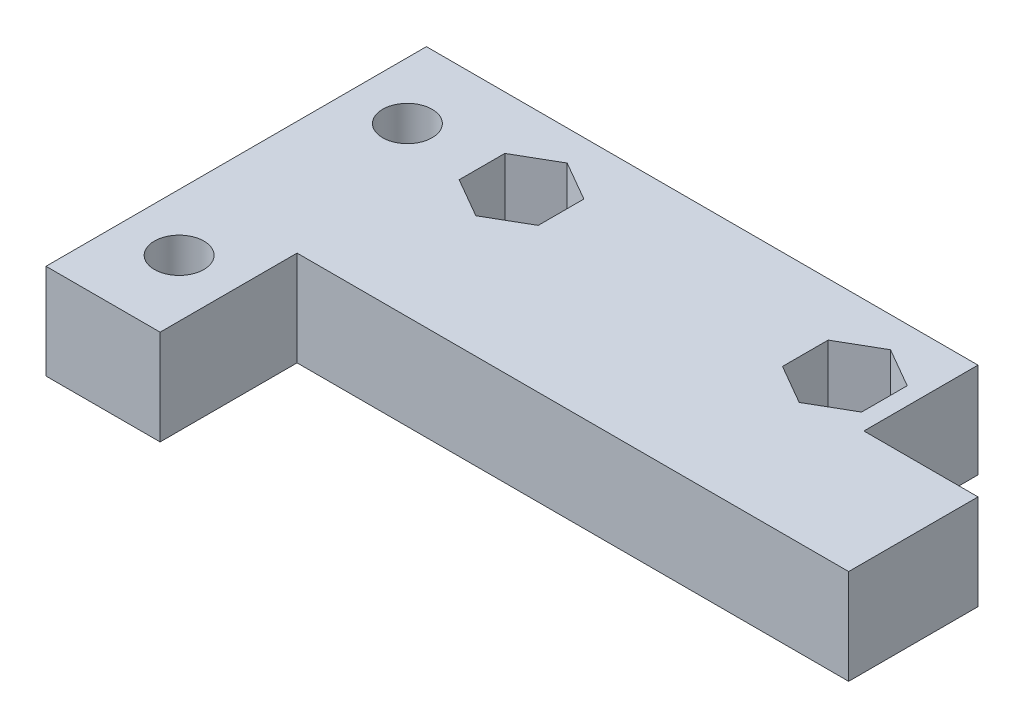
ISO-10303-21;
HEADER;
FILE_DESCRIPTION(('STEP AP214'),'2;1');
FILE_NAME('part.step','',(''),(''),'','','');
FILE_SCHEMA(('AUTOMOTIVE_DESIGN { 1 0 10303 214 1 1 1 1 }'));
ENDSEC;
DATA;
#1=APPLICATION_CONTEXT('core data for automotive mechanical design processes');
#2=APPLICATION_PROTOCOL_DEFINITION('international standard','automotive_design',2000,#1);
#3=PRODUCT_CONTEXT('',#1,'mechanical');
#4=PRODUCT('Part','Part','',(#3));
#5=PRODUCT_RELATED_PRODUCT_CATEGORY('part','',(#4));
#6=PRODUCT_DEFINITION_FORMATION('','',#4);
#7=PRODUCT_DEFINITION_CONTEXT('part definition',#1,'design');
#8=PRODUCT_DEFINITION('design','',#6,#7);
#9=PRODUCT_DEFINITION_SHAPE('','',#8);
#10=(LENGTH_UNIT() NAMED_UNIT(*) SI_UNIT(.MILLI.,.METRE.));
#11=(NAMED_UNIT(*) PLANE_ANGLE_UNIT() SI_UNIT($,.RADIAN.));
#12=(NAMED_UNIT(*) SI_UNIT($,.STERADIAN.) SOLID_ANGLE_UNIT());
#13=UNCERTAINTY_MEASURE_WITH_UNIT(LENGTH_MEASURE(1.E-05),#10,'distance_accuracy_value','');
#14=(GEOMETRIC_REPRESENTATION_CONTEXT(3) GLOBAL_UNCERTAINTY_ASSIGNED_CONTEXT((#13)) GLOBAL_UNIT_ASSIGNED_CONTEXT((#10,
#11,#12)) REPRESENTATION_CONTEXT('',''));
#15=CARTESIAN_POINT('',(0.,0.,0.));
#16=DIRECTION('',(0.,0.,1.));
#17=DIRECTION('',(1.,0.,0.));
#18=AXIS2_PLACEMENT_3D('',#15,#16,#17);
#19=CARTESIAN_POINT('',(3.,8.,-16.));
#20=DIRECTION('',(0.,-1.,0.));
#21=DIRECTION('',(0.,0.,-1.));
#22=AXIS2_PLACEMENT_3D('',#19,#20,#21);
#23=CYLINDRICAL_SURFACE('',#22,1.3);
#24=CARTESIAN_POINT('',(3.,8.,-16.));
#25=DIRECTION('',(0.,1.,0.));
#26=DIRECTION('',(0.,0.,1.));
#27=AXIS2_PLACEMENT_3D('',#24,#25,#26);
#28=CIRCLE('',#27,1.3);
#29=CARTESIAN_POINT('',(3.,8.,-14.7));
#30=VERTEX_POINT('',#29);
#31=EDGE_CURVE('E226',#30,#30,#28,.T.);
#32=ORIENTED_EDGE('',*,*,#31,.T.);
#33=EDGE_LOOP('',(#32));
#34=FACE_BOUND('',#33,.T.);
#35=CARTESIAN_POINT('',(3.,3.,-16.));
#36=DIRECTION('',(0.,-1.,0.));
#37=DIRECTION('',(0.,0.,-1.));
#38=AXIS2_PLACEMENT_3D('',#35,#36,#37);
#39=CIRCLE('',#38,1.3);
#40=CARTESIAN_POINT('',(3.,3.,-17.3));
#41=VERTEX_POINT('',#40);
#42=EDGE_CURVE('E292',#41,#41,#39,.T.);
#43=ORIENTED_EDGE('',*,*,#42,.T.);
#44=EDGE_LOOP('',(#43));
#45=FACE_BOUND('',#44,.T.);
#46=ADVANCED_FACE('F33',(#34,#45),#23,.F.);
#47=CARTESIAN_POINT('',(3.,8.,-4.));
#48=DIRECTION('',(0.,-1.,0.));
#49=DIRECTION('',(0.,0.,-1.));
#50=AXIS2_PLACEMENT_3D('',#47,#48,#49);
#51=CYLINDRICAL_SURFACE('',#50,1.3);
#52=CARTESIAN_POINT('',(3.,8.,-4.));
#53=DIRECTION('',(0.,1.,0.));
#54=DIRECTION('',(0.,0.,1.));
#55=AXIS2_PLACEMENT_3D('',#52,#53,#54);
#56=CIRCLE('',#55,1.3);
#57=CARTESIAN_POINT('',(3.,8.,-2.7));
#58=VERTEX_POINT('',#57);
#59=EDGE_CURVE('E229',#58,#58,#56,.T.);
#60=ORIENTED_EDGE('',*,*,#59,.T.);
#61=EDGE_LOOP('',(#60));
#62=FACE_BOUND('',#61,.T.);
#63=CARTESIAN_POINT('',(3.,3.,-4.));
#64=DIRECTION('',(0.,-1.,0.));
#65=DIRECTION('',(0.,0.,-1.));
#66=AXIS2_PLACEMENT_3D('',#63,#64,#65);
#67=CIRCLE('',#66,1.3);
#68=CARTESIAN_POINT('',(3.,3.,-5.3));
#69=VERTEX_POINT('',#68);
#70=EDGE_CURVE('E295',#69,#69,#67,.T.);
#71=ORIENTED_EDGE('',*,*,#70,.T.);
#72=EDGE_LOOP('',(#71));
#73=FACE_BOUND('',#72,.T.);
#74=ADVANCED_FACE('F363',(#62,#73),#51,.F.);
#75=CARTESIAN_POINT('',(35.,8.,0.));
#76=DIRECTION('',(-1.,0.,0.));
#77=DIRECTION('',(0.,0.,1.));
#78=AXIS2_PLACEMENT_3D('',#75,#76,#77);
#79=PLANE('',#78);
#80=DIRECTION('',(0.,0.,-1.));
#81=VECTOR('',#80,1.);
#82=CARTESIAN_POINT('',(35.,3.,0.));
#83=LINE('',#82,#81);
#84=CARTESIAN_POINT('',(35.,3.,-7.2));
#85=VERTEX_POINT('',#84);
#86=CARTESIAN_POINT('',(35.,3.,-14.));
#87=VERTEX_POINT('',#86);
#88=EDGE_CURVE('E177',#85,#87,#83,.T.);
#89=ORIENTED_EDGE('',*,*,#88,.T.);
#90=DIRECTION('',(0.,-1.,0.));
#91=VECTOR('',#90,1.);
#92=CARTESIAN_POINT('',(35.,8.,-14.));
#93=LINE('',#92,#91);
#94=CARTESIAN_POINT('',(35.,8.,-14.));
#95=VERTEX_POINT('',#94);
#96=EDGE_CURVE('E219',#95,#87,#93,.T.);
#97=ORIENTED_EDGE('',*,*,#96,.F.);
#98=DIRECTION('',(0.,0.,-1.));
#99=VECTOR('',#98,1.);
#100=CARTESIAN_POINT('',(35.,8.,0.));
#101=LINE('',#100,#99);
#102=CARTESIAN_POINT('',(35.,8.,-7.2));
#103=VERTEX_POINT('',#102);
#104=EDGE_CURVE('E194',#103,#95,#101,.T.);
#105=ORIENTED_EDGE('',*,*,#104,.F.);
#106=DIRECTION('',(0.,-1.,0.));
#107=VECTOR('',#106,1.);
#108=CARTESIAN_POINT('',(35.,8.,-7.2));
#109=LINE('',#108,#107);
#110=EDGE_CURVE('E202',#103,#85,#109,.T.);
#111=ORIENTED_EDGE('',*,*,#110,.T.);
#112=EDGE_LOOP('',(#89,#97,#105,#111));
#113=FACE_BOUND('',#112,.T.);
#114=ADVANCED_FACE('F331',(#113),#79,.F.);
#115=CARTESIAN_POINT('',(0.,8.,-20.));
#116=DIRECTION('',(0.,0.,1.));
#117=DIRECTION('',(1.,0.,0.));
#118=AXIS2_PLACEMENT_3D('',#115,#116,#117);
#119=PLANE('',#118);
#120=DIRECTION('',(-1.,0.,0.));
#121=VECTOR('',#120,1.);
#122=CARTESIAN_POINT('',(0.,3.,-20.));
#123=LINE('',#122,#121);
#124=CARTESIAN_POINT('',(29.,3.,-20.));
#125=VERTEX_POINT('',#124);
#126=CARTESIAN_POINT('',(0.,3.,-20.));
#127=VERTEX_POINT('',#126);
#128=EDGE_CURVE('E326',#125,#127,#123,.T.);
#129=ORIENTED_EDGE('',*,*,#128,.T.);
#130=DIRECTION('',(0.,-1.,0.));
#131=VECTOR('',#130,1.);
#132=CARTESIAN_POINT('',(0.,8.,-20.));
#133=LINE('',#132,#131);
#134=CARTESIAN_POINT('',(0.,8.,-20.));
#135=VERTEX_POINT('',#134);
#136=EDGE_CURVE('E184',#135,#127,#133,.T.);
#137=ORIENTED_EDGE('',*,*,#136,.F.);
#138=DIRECTION('',(-1.,0.,0.));
#139=VECTOR('',#138,1.);
#140=CARTESIAN_POINT('',(0.,8.,-20.));
#141=LINE('',#140,#139);
#142=CARTESIAN_POINT('',(29.,8.,-20.));
#143=VERTEX_POINT('',#142);
#144=EDGE_CURVE('E190',#143,#135,#141,.T.);
#145=ORIENTED_EDGE('',*,*,#144,.F.);
#146=DIRECTION('',(0.,-1.,0.));
#147=VECTOR('',#146,1.);
#148=CARTESIAN_POINT('',(29.,8.,-20.));
#149=LINE('',#148,#147);
#150=EDGE_CURVE('E213',#143,#125,#149,.T.);
#151=ORIENTED_EDGE('',*,*,#150,.T.);
#152=EDGE_LOOP('',(#129,#137,#145,#151));
#153=FACE_BOUND('',#152,.T.);
#154=ADVANCED_FACE('F350',(#153),#119,.F.);
#155=CARTESIAN_POINT('',(0.,8.,0.));
#156=DIRECTION('',(0.,0.,-1.));
#157=DIRECTION('',(-1.,0.,0.));
#158=AXIS2_PLACEMENT_3D('',#155,#156,#157);
#159=PLANE('',#158);
#160=DIRECTION('',(1.,0.,0.));
#161=VECTOR('',#160,1.);
#162=CARTESIAN_POINT('',(0.,3.,0.));
#163=LINE('',#162,#161);
#164=CARTESIAN_POINT('',(0.,3.,0.));
#165=VERTEX_POINT('',#164);
#166=CARTESIAN_POINT('',(6.,3.,0.));
#167=VERTEX_POINT('',#166);
#168=EDGE_CURVE('E167',#165,#167,#163,.T.);
#169=ORIENTED_EDGE('',*,*,#168,.T.);
#170=DIRECTION('',(0.,-1.,0.));
#171=VECTOR('',#170,1.);
#172=CARTESIAN_POINT('',(6.,0.8,0.));
#173=LINE('',#172,#171);
#174=CARTESIAN_POINT('',(6.,8.,0.));
#175=VERTEX_POINT('',#174);
#176=EDGE_CURVE('E200',#175,#167,#173,.T.);
#177=ORIENTED_EDGE('',*,*,#176,.F.);
#178=DIRECTION('',(1.,0.,0.));
#179=VECTOR('',#178,1.);
#180=CARTESIAN_POINT('',(0.,8.,0.));
#181=LINE('',#180,#179);
#182=CARTESIAN_POINT('',(0.,8.,0.));
#183=VERTEX_POINT('',#182);
#184=EDGE_CURVE('E188',#183,#175,#181,.T.);
#185=ORIENTED_EDGE('',*,*,#184,.F.);
#186=DIRECTION('',(0.,-1.,0.));
#187=VECTOR('',#186,1.);
#188=CARTESIAN_POINT('',(0.,8.,0.));
#189=LINE('',#188,#187);
#190=EDGE_CURVE('E41',#183,#165,#189,.T.);
#191=ORIENTED_EDGE('',*,*,#190,.T.);
#192=EDGE_LOOP('',(#169,#177,#185,#191));
#193=FACE_BOUND('',#192,.T.);
#194=ADVANCED_FACE('F186',(#193),#159,.F.);
#195=CARTESIAN_POINT('',(0.,8.,0.));
#196=DIRECTION('',(1.,0.,0.));
#197=DIRECTION('',(0.,0.,-1.));
#198=AXIS2_PLACEMENT_3D('',#195,#196,#197);
#199=PLANE('',#198);
#200=DIRECTION('',(0.,0.,1.));
#201=VECTOR('',#200,1.);
#202=CARTESIAN_POINT('',(0.,3.,0.));
#203=LINE('',#202,#201);
#204=EDGE_CURVE('E170',#127,#165,#203,.T.);
#205=ORIENTED_EDGE('',*,*,#204,.T.);
#206=ORIENTED_EDGE('',*,*,#190,.F.);
#207=DIRECTION('',(0.,0.,1.));
#208=VECTOR('',#207,1.);
#209=CARTESIAN_POINT('',(0.,8.,0.));
#210=LINE('',#209,#208);
#211=EDGE_CURVE('E198',#135,#183,#210,.T.);
#212=ORIENTED_EDGE('',*,*,#211,.F.);
#213=ORIENTED_EDGE('',*,*,#136,.T.);
#214=EDGE_LOOP('',(#205,#206,#212,#213));
#215=FACE_BOUND('',#214,.T.);
#216=ADVANCED_FACE('F35',(#215),#199,.F.);
#217=CARTESIAN_POINT('',(6.,0.8,0.));
#218=DIRECTION('',(1.,0.,0.));
#219=DIRECTION('',(0.,0.,-1.));
#220=AXIS2_PLACEMENT_3D('',#217,#218,#219);
#221=PLANE('',#220);
#222=ORIENTED_EDGE('',*,*,#176,.T.);
#223=DIRECTION('',(0.,0.,-1.));
#224=VECTOR('',#223,1.);
#225=CARTESIAN_POINT('',(6.,3.,0.));
#226=LINE('',#225,#224);
#227=CARTESIAN_POINT('',(6.,3.,-7.2));
#228=VERTEX_POINT('',#227);
#229=EDGE_CURVE('E173',#167,#228,#226,.T.);
#230=ORIENTED_EDGE('',*,*,#229,.T.);
#231=DIRECTION('',(0.,-1.,0.));
#232=VECTOR('',#231,1.);
#233=CARTESIAN_POINT('',(6.,8.,-7.2));
#234=LINE('',#233,#232);
#235=CARTESIAN_POINT('',(6.,8.,-7.2));
#236=VERTEX_POINT('',#235);
#237=EDGE_CURVE('E205',#236,#228,#234,.T.);
#238=ORIENTED_EDGE('',*,*,#237,.F.);
#239=DIRECTION('',(0.,0.,1.));
#240=VECTOR('',#239,1.);
#241=CARTESIAN_POINT('',(6.,8.,0.));
#242=LINE('',#241,#240);
#243=EDGE_CURVE('E210',#236,#175,#242,.T.);
#244=ORIENTED_EDGE('',*,*,#243,.T.);
#245=EDGE_LOOP('',(#222,#230,#238,#244));
#246=FACE_BOUND('',#245,.T.);
#247=ADVANCED_FACE('F348',(#246),#221,.T.);
#248=CARTESIAN_POINT('',(6.,8.,-7.2));
#249=DIRECTION('',(0.,0.,1.));
#250=DIRECTION('',(1.,0.,0.));
#251=AXIS2_PLACEMENT_3D('',#248,#249,#250);
#252=PLANE('',#251);
#253=ORIENTED_EDGE('',*,*,#237,.T.);
#254=DIRECTION('',(1.,0.,0.));
#255=VECTOR('',#254,1.);
#256=CARTESIAN_POINT('',(6.,3.,-7.2));
#257=LINE('',#256,#255);
#258=EDGE_CURVE('E299',#228,#85,#257,.T.);
#259=ORIENTED_EDGE('',*,*,#258,.T.);
#260=ORIENTED_EDGE('',*,*,#110,.F.);
#261=DIRECTION('',(-1.,0.,0.));
#262=VECTOR('',#261,1.);
#263=CARTESIAN_POINT('',(6.,8.,-7.2));
#264=LINE('',#263,#262);
#265=EDGE_CURVE('E208',#103,#236,#264,.T.);
#266=ORIENTED_EDGE('',*,*,#265,.T.);
#267=EDGE_LOOP('',(#253,#259,#260,#266));
#268=FACE_BOUND('',#267,.T.);
#269=ADVANCED_FACE('F346',(#268),#252,.T.);
#270=CARTESIAN_POINT('',(29.,8.,-20.));
#271=DIRECTION('',(1.,0.,0.));
#272=DIRECTION('',(0.,0.,-1.));
#273=AXIS2_PLACEMENT_3D('',#270,#271,#272);
#274=PLANE('',#273);
#275=DIRECTION('',(0.,-1.,0.));
#276=VECTOR('',#275,1.);
#277=CARTESIAN_POINT('',(29.,8.,-14.));
#278=LINE('',#277,#276);
#279=CARTESIAN_POINT('',(29.,8.,-14.));
#280=VERTEX_POINT('',#279);
#281=CARTESIAN_POINT('',(29.,3.,-14.));
#282=VERTEX_POINT('',#281);
#283=EDGE_CURVE('E216',#280,#282,#278,.T.);
#284=ORIENTED_EDGE('',*,*,#283,.T.);
#285=DIRECTION('',(0.,0.,-1.));
#286=VECTOR('',#285,1.);
#287=CARTESIAN_POINT('',(29.,3.,-20.));
#288=LINE('',#287,#286);
#289=EDGE_CURVE('E48',#282,#125,#288,.T.);
#290=ORIENTED_EDGE('',*,*,#289,.T.);
#291=ORIENTED_EDGE('',*,*,#150,.F.);
#292=DIRECTION('',(0.,0.,1.));
#293=VECTOR('',#292,1.);
#294=CARTESIAN_POINT('',(29.,8.,-20.));
#295=LINE('',#294,#293);
#296=EDGE_CURVE('E224',#143,#280,#295,.T.);
#297=ORIENTED_EDGE('',*,*,#296,.T.);
#298=EDGE_LOOP('',(#284,#290,#291,#297));
#299=FACE_BOUND('',#298,.T.);
#300=ADVANCED_FACE('F352',(#299),#274,.T.);
#301=CARTESIAN_POINT('',(35.,8.,-14.));
#302=DIRECTION('',(0.,0.,-1.));
#303=DIRECTION('',(-1.,0.,0.));
#304=AXIS2_PLACEMENT_3D('',#301,#302,#303);
#305=PLANE('',#304);
#306=ORIENTED_EDGE('',*,*,#96,.T.);
#307=DIRECTION('',(-1.,0.,0.));
#308=VECTOR('',#307,1.);
#309=CARTESIAN_POINT('',(35.,3.,-14.));
#310=LINE('',#309,#308);
#311=EDGE_CURVE('E303',#87,#282,#310,.T.);
#312=ORIENTED_EDGE('',*,*,#311,.T.);
#313=ORIENTED_EDGE('',*,*,#283,.F.);
#314=DIRECTION('',(1.,0.,0.));
#315=VECTOR('',#314,1.);
#316=CARTESIAN_POINT('',(35.,8.,-14.));
#317=LINE('',#316,#315);
#318=EDGE_CURVE('E222',#280,#95,#317,.T.);
#319=ORIENTED_EDGE('',*,*,#318,.T.);
#320=EDGE_LOOP('',(#306,#312,#313,#319));
#321=FACE_BOUND('',#320,.T.);
#322=ADVANCED_FACE('F334',(#321),#305,.T.);
#323=CARTESIAN_POINT('',(10.2174337148169,0.,-17.6971143170299));
#324=DIRECTION('',(0.500000000000002,0.,-0.866025403784438));
#325=DIRECTION('',(-0.866025403784438,0.,-0.500000000000002));
#326=AXIS2_PLACEMENT_3D('',#323,#324,#325);
#327=PLANE('',#326);
#328=DIRECTION('',(-0.866025403784438,0.,-0.500000000000002));
#329=VECTOR('',#328,1.);
#330=CARTESIAN_POINT('',(10.2174337148169,3.,-17.6971143170299));
#331=LINE('',#330,#329);
#332=CARTESIAN_POINT('',(11.0784609690827,3.,-17.2));
#333=VERTEX_POINT('',#332);
#334=CARTESIAN_POINT('',(9.00000000000001,3.,-18.4));
#335=VERTEX_POINT('',#334);
#336=EDGE_CURVE('E56',#333,#335,#331,.T.);
#337=ORIENTED_EDGE('',*,*,#336,.F.);
#338=DIRECTION('',(0.,1.,0.));
#339=VECTOR('',#338,1.);
#340=CARTESIAN_POINT('',(11.0784609690827,0.,-17.2));
#341=LINE('',#340,#339);
#342=CARTESIAN_POINT('',(11.0784609690827,8.,-17.2));
#343=VERTEX_POINT('',#342);
#344=EDGE_CURVE('E232',#333,#343,#341,.T.);
#345=ORIENTED_EDGE('',*,*,#344,.T.);
#346=DIRECTION('',(-0.866025403784438,0.,-0.500000000000002));
#347=VECTOR('',#346,1.);
#348=CARTESIAN_POINT('',(10.2174337148169,8.,-17.6971143170299));
#349=LINE('',#348,#347);
#350=CARTESIAN_POINT('',(9.00000000000001,8.,-18.4));
#351=VERTEX_POINT('',#350);
#352=EDGE_CURVE('E259',#343,#351,#349,.T.);
#353=ORIENTED_EDGE('',*,*,#352,.T.);
#354=DIRECTION('',(0.,1.,0.));
#355=VECTOR('',#354,1.);
#356=CARTESIAN_POINT('',(9.00000000000001,0.,-18.4));
#357=LINE('',#356,#355);
#358=EDGE_CURVE('E233',#335,#351,#357,.T.);
#359=ORIENTED_EDGE('',*,*,#358,.F.);
#360=EDGE_LOOP('',(#337,#345,#353,#359));
#361=FACE_BOUND('',#360,.T.);
#362=ADVANCED_FACE('F359',(#361),#327,.F.);
#363=CARTESIAN_POINT('',(11.0784609690827,0.,0.));
#364=DIRECTION('',(1.,0.,0.));
#365=DIRECTION('',(0.,0.,-1.));
#366=AXIS2_PLACEMENT_3D('',#363,#364,#365);
#367=PLANE('',#366);
#368=DIRECTION('',(0.,0.,-1.));
#369=VECTOR('',#368,1.);
#370=CARTESIAN_POINT('',(11.0784609690827,3.,0.));
#371=LINE('',#370,#369);
#372=CARTESIAN_POINT('',(11.0784609690827,3.,-14.8));
#373=VERTEX_POINT('',#372);
#374=EDGE_CURVE('E306',#373,#333,#371,.T.);
#375=ORIENTED_EDGE('',*,*,#374,.F.);
#376=DIRECTION('',(0.,1.,0.));
#377=VECTOR('',#376,1.);
#378=CARTESIAN_POINT('',(11.0784609690827,0.,-14.8));
#379=LINE('',#378,#377);
#380=CARTESIAN_POINT('',(11.0784609690827,8.,-14.8));
#381=VERTEX_POINT('',#380);
#382=EDGE_CURVE('E242',#373,#381,#379,.T.);
#383=ORIENTED_EDGE('',*,*,#382,.T.);
#384=DIRECTION('',(0.,0.,-1.));
#385=VECTOR('',#384,1.);
#386=CARTESIAN_POINT('',(11.0784609690827,8.,0.));
#387=LINE('',#386,#385);
#388=EDGE_CURVE('E236',#381,#343,#387,.T.);
#389=ORIENTED_EDGE('',*,*,#388,.T.);
#390=ORIENTED_EDGE('',*,*,#344,.F.);
#391=EDGE_LOOP('',(#375,#383,#389,#390));
#392=FACE_BOUND('',#391,.T.);
#393=ADVANCED_FACE('F375',(#392),#367,.F.);
#394=CARTESIAN_POINT('',(-3.63897274573418,0.,-6.30288568297002));
#395=DIRECTION('',(0.5,0.,0.866025403784438));
#396=DIRECTION('',(0.866025403784439,0.,-0.5));
#397=AXIS2_PLACEMENT_3D('',#394,#395,#396);
#398=PLANE('',#397);
#399=DIRECTION('',(0.866025403784439,0.,-0.5));
#400=VECTOR('',#399,1.);
#401=CARTESIAN_POINT('',(-3.63897274573418,3.,-6.30288568297002));
#402=LINE('',#401,#400);
#403=CARTESIAN_POINT('',(9.00000000000001,3.,-13.6));
#404=VERTEX_POINT('',#403);
#405=EDGE_CURVE('E308',#404,#373,#402,.T.);
#406=ORIENTED_EDGE('',*,*,#405,.F.);
#407=DIRECTION('',(0.,1.,0.));
#408=VECTOR('',#407,1.);
#409=CARTESIAN_POINT('',(9.00000000000001,0.,-13.6));
#410=LINE('',#409,#408);
#411=CARTESIAN_POINT('',(9.00000000000001,8.,-13.6));
#412=VERTEX_POINT('',#411);
#413=EDGE_CURVE('E240',#404,#412,#410,.T.);
#414=ORIENTED_EDGE('',*,*,#413,.T.);
#415=DIRECTION('',(0.866025403784439,0.,-0.5));
#416=VECTOR('',#415,1.);
#417=CARTESIAN_POINT('',(-3.63897274573418,8.,-6.30288568297002));
#418=LINE('',#417,#416);
#419=EDGE_CURVE('E247',#412,#381,#418,.T.);
#420=ORIENTED_EDGE('',*,*,#419,.T.);
#421=ORIENTED_EDGE('',*,*,#382,.F.);
#422=EDGE_LOOP('',(#406,#414,#420,#421));
#423=FACE_BOUND('',#422,.T.);
#424=ADVANCED_FACE('F389',(#423),#398,.F.);
#425=CARTESIAN_POINT('',(8.13897274573419,0.,-14.09711431703));
#426=DIRECTION('',(-0.5,0.,0.866025403784438));
#427=DIRECTION('',(0.866025403784438,0.,0.5));
#428=AXIS2_PLACEMENT_3D('',#425,#426,#427);
#429=PLANE('',#428);
#430=DIRECTION('',(0.866025403784438,0.,0.5));
#431=VECTOR('',#430,1.);
#432=CARTESIAN_POINT('',(8.13897274573419,3.,-14.09711431703));
#433=LINE('',#432,#431);
#434=CARTESIAN_POINT('',(6.92153903091735,3.,-14.8));
#435=VERTEX_POINT('',#434);
#436=EDGE_CURVE('E310',#435,#404,#433,.T.);
#437=ORIENTED_EDGE('',*,*,#436,.F.);
#438=DIRECTION('',(0.,1.,0.));
#439=VECTOR('',#438,1.);
#440=CARTESIAN_POINT('',(6.92153903091735,0.,-14.8));
#441=LINE('',#440,#439);
#442=CARTESIAN_POINT('',(6.92153903091735,8.,-14.8));
#443=VERTEX_POINT('',#442);
#444=EDGE_CURVE('E238',#435,#443,#441,.T.);
#445=ORIENTED_EDGE('',*,*,#444,.T.);
#446=DIRECTION('',(0.866025403784438,0.,0.5));
#447=VECTOR('',#446,1.);
#448=CARTESIAN_POINT('',(8.13897274573419,8.,-14.09711431703));
#449=LINE('',#448,#447);
#450=EDGE_CURVE('E250',#443,#412,#449,.T.);
#451=ORIENTED_EDGE('',*,*,#450,.T.);
#452=ORIENTED_EDGE('',*,*,#413,.F.);
#453=EDGE_LOOP('',(#437,#445,#451,#452));
#454=FACE_BOUND('',#453,.T.);
#455=ADVANCED_FACE('F385',(#454),#429,.F.);
#456=CARTESIAN_POINT('',(6.92153903091735,0.,0.));
#457=DIRECTION('',(-1.,0.,0.));
#458=DIRECTION('',(0.,0.,1.));
#459=AXIS2_PLACEMENT_3D('',#456,#457,#458);
#460=PLANE('',#459);
#461=DIRECTION('',(0.,0.,1.));
#462=VECTOR('',#461,1.);
#463=CARTESIAN_POINT('',(6.92153903091735,3.,0.));
#464=LINE('',#463,#462);
#465=CARTESIAN_POINT('',(6.92153903091735,3.,-17.2));
#466=VERTEX_POINT('',#465);
#467=EDGE_CURVE('E312',#466,#435,#464,.T.);
#468=ORIENTED_EDGE('',*,*,#467,.F.);
#469=DIRECTION('',(0.,1.,0.));
#470=VECTOR('',#469,1.);
#471=CARTESIAN_POINT('',(6.92153903091735,0.,-17.2));
#472=LINE('',#471,#470);
#473=CARTESIAN_POINT('',(6.92153903091735,8.,-17.2));
#474=VERTEX_POINT('',#473);
#475=EDGE_CURVE('E235',#466,#474,#472,.T.);
#476=ORIENTED_EDGE('',*,*,#475,.T.);
#477=DIRECTION('',(0.,0.,1.));
#478=VECTOR('',#477,1.);
#479=CARTESIAN_POINT('',(6.92153903091735,8.,0.));
#480=LINE('',#479,#478);
#481=EDGE_CURVE('E253',#474,#443,#480,.T.);
#482=ORIENTED_EDGE('',*,*,#481,.T.);
#483=ORIENTED_EDGE('',*,*,#444,.F.);
#484=EDGE_LOOP('',(#468,#476,#482,#483));
#485=FACE_BOUND('',#484,.T.);
#486=ADVANCED_FACE('F381',(#485),#460,.F.);
#487=CARTESIAN_POINT('',(-5.71743371481683,0.,-9.90288568297003));
#488=DIRECTION('',(-0.5,0.,-0.866025403784439));
#489=DIRECTION('',(-0.866025403784439,0.,0.5));
#490=AXIS2_PLACEMENT_3D('',#487,#488,#489);
#491=PLANE('',#490);
#492=DIRECTION('',(-0.866025403784439,0.,0.5));
#493=VECTOR('',#492,1.);
#494=CARTESIAN_POINT('',(-5.71743371481683,3.,-9.90288568297003));
#495=LINE('',#494,#493);
#496=EDGE_CURVE('E314',#335,#466,#495,.T.);
#497=ORIENTED_EDGE('',*,*,#496,.F.);
#498=ORIENTED_EDGE('',*,*,#358,.T.);
#499=DIRECTION('',(-0.866025403784439,0.,0.5));
#500=VECTOR('',#499,1.);
#501=CARTESIAN_POINT('',(-5.71743371481683,8.,-9.90288568297003));
#502=LINE('',#501,#500);
#503=EDGE_CURVE('E256',#351,#474,#502,.T.);
#504=ORIENTED_EDGE('',*,*,#503,.T.);
#505=ORIENTED_EDGE('',*,*,#475,.F.);
#506=EDGE_LOOP('',(#497,#498,#504,#505));
#507=FACE_BOUND('',#506,.T.);
#508=ADVANCED_FACE('F377',(#507),#491,.F.);
#509=CARTESIAN_POINT('',(14.4674337148168,0.,-25.0583302491977));
#510=DIRECTION('',(0.499999999999999,0.,-0.866025403784439));
#511=DIRECTION('',(-0.866025403784439,0.,-0.499999999999999));
#512=AXIS2_PLACEMENT_3D('',#509,#510,#511);
#513=PLANE('',#512);
#514=DIRECTION('',(-0.866025403784439,0.,-0.499999999999999));
#515=VECTOR('',#514,1.);
#516=CARTESIAN_POINT('',(14.4674337148168,3.,-25.0583302491977));
#517=LINE('',#516,#515);
#518=CARTESIAN_POINT('',(28.0784609690827,3.,-17.2));
#519=VERTEX_POINT('',#518);
#520=CARTESIAN_POINT('',(26.,3.,-18.4));
#521=VERTEX_POINT('',#520);
#522=EDGE_CURVE('E316',#519,#521,#517,.T.);
#523=ORIENTED_EDGE('',*,*,#522,.F.);
#524=DIRECTION('',(0.,1.,0.));
#525=VECTOR('',#524,1.);
#526=CARTESIAN_POINT('',(28.0784609690827,0.,-17.2));
#527=LINE('',#526,#525);
#528=CARTESIAN_POINT('',(28.0784609690827,8.,-17.2));
#529=VERTEX_POINT('',#528);
#530=EDGE_CURVE('E262',#519,#529,#527,.T.);
#531=ORIENTED_EDGE('',*,*,#530,.T.);
#532=DIRECTION('',(-0.866025403784439,0.,-0.499999999999999));
#533=VECTOR('',#532,1.);
#534=CARTESIAN_POINT('',(14.4674337148168,8.,-25.0583302491977));
#535=LINE('',#534,#533);
#536=CARTESIAN_POINT('',(26.,8.,-18.4));
#537=VERTEX_POINT('',#536);
#538=EDGE_CURVE('E289',#529,#537,#535,.T.);
#539=ORIENTED_EDGE('',*,*,#538,.T.);
#540=DIRECTION('',(0.,1.,0.));
#541=VECTOR('',#540,1.);
#542=CARTESIAN_POINT('',(26.,0.,-18.4));
#543=LINE('',#542,#541);
#544=EDGE_CURVE('E263',#521,#537,#543,.T.);
#545=ORIENTED_EDGE('',*,*,#544,.F.);
#546=EDGE_LOOP('',(#523,#531,#539,#545));
#547=FACE_BOUND('',#546,.T.);
#548=ADVANCED_FACE('F380',(#547),#513,.F.);
#549=CARTESIAN_POINT('',(28.0784609690827,0.,0.));
#550=DIRECTION('',(1.,0.,0.));
#551=DIRECTION('',(0.,0.,-1.));
#552=AXIS2_PLACEMENT_3D('',#549,#550,#551);
#553=PLANE('',#552);
#554=DIRECTION('',(0.,0.,-1.));
#555=VECTOR('',#554,1.);
#556=CARTESIAN_POINT('',(28.0784609690827,3.,0.));
#557=LINE('',#556,#555);
#558=CARTESIAN_POINT('',(28.0784609690827,3.,-14.8));
#559=VERTEX_POINT('',#558);
#560=EDGE_CURVE('E318',#559,#519,#557,.T.);
#561=ORIENTED_EDGE('',*,*,#560,.F.);
#562=DIRECTION('',(0.,1.,0.));
#563=VECTOR('',#562,1.);
#564=CARTESIAN_POINT('',(28.0784609690827,0.,-14.8));
#565=LINE('',#564,#563);
#566=CARTESIAN_POINT('',(28.0784609690827,8.,-14.8));
#567=VERTEX_POINT('',#566);
#568=EDGE_CURVE('E272',#559,#567,#565,.T.);
#569=ORIENTED_EDGE('',*,*,#568,.T.);
#570=DIRECTION('',(0.,0.,-1.));
#571=VECTOR('',#570,1.);
#572=CARTESIAN_POINT('',(28.0784609690827,8.,0.));
#573=LINE('',#572,#571);
#574=EDGE_CURVE('E266',#567,#529,#573,.T.);
#575=ORIENTED_EDGE('',*,*,#574,.T.);
#576=ORIENTED_EDGE('',*,*,#530,.F.);
#577=EDGE_LOOP('',(#561,#569,#575,#576));
#578=FACE_BOUND('',#577,.T.);
#579=ADVANCED_FACE('F399',(#578),#553,.F.);
#580=CARTESIAN_POINT('',(0.611027254265822,0.,1.05833024919771));
#581=DIRECTION('',(0.5,0.,0.866025403784438));
#582=DIRECTION('',(0.866025403784439,0.,-0.5));
#583=AXIS2_PLACEMENT_3D('',#580,#581,#582);
#584=PLANE('',#583);
#585=DIRECTION('',(0.866025403784439,0.,-0.5));
#586=VECTOR('',#585,1.);
#587=CARTESIAN_POINT('',(0.611027254265822,3.,1.05833024919771));
#588=LINE('',#587,#586);
#589=CARTESIAN_POINT('',(26.,3.,-13.6));
#590=VERTEX_POINT('',#589);
#591=EDGE_CURVE('E320',#590,#559,#588,.T.);
#592=ORIENTED_EDGE('',*,*,#591,.F.);
#593=DIRECTION('',(0.,1.,0.));
#594=VECTOR('',#593,1.);
#595=CARTESIAN_POINT('',(26.,0.,-13.6));
#596=LINE('',#595,#594);
#597=CARTESIAN_POINT('',(26.,8.,-13.6));
#598=VERTEX_POINT('',#597);
#599=EDGE_CURVE('E270',#590,#598,#596,.T.);
#600=ORIENTED_EDGE('',*,*,#599,.T.);
#601=DIRECTION('',(0.866025403784439,0.,-0.5));
#602=VECTOR('',#601,1.);
#603=CARTESIAN_POINT('',(0.611027254265822,8.,1.05833024919771));
#604=LINE('',#603,#602);
#605=EDGE_CURVE('E277',#598,#567,#604,.T.);
#606=ORIENTED_EDGE('',*,*,#605,.T.);
#607=ORIENTED_EDGE('',*,*,#568,.F.);
#608=EDGE_LOOP('',(#592,#600,#606,#607));
#609=FACE_BOUND('',#608,.T.);
#610=ADVANCED_FACE('F412',(#609),#584,.F.);
#611=CARTESIAN_POINT('',(12.3889727457342,0.,-21.4583302491977));
#612=DIRECTION('',(-0.499999999999999,0.,0.866025403784439));
#613=DIRECTION('',(0.866025403784439,0.,0.499999999999999));
#614=AXIS2_PLACEMENT_3D('',#611,#612,#613);
#615=PLANE('',#614);
#616=DIRECTION('',(0.866025403784439,0.,0.499999999999999));
#617=VECTOR('',#616,1.);
#618=CARTESIAN_POINT('',(12.3889727457342,3.,-21.4583302491977));
#619=LINE('',#618,#617);
#620=CARTESIAN_POINT('',(23.9215390309173,3.,-14.8));
#621=VERTEX_POINT('',#620);
#622=EDGE_CURVE('E322',#621,#590,#619,.T.);
#623=ORIENTED_EDGE('',*,*,#622,.F.);
#624=DIRECTION('',(0.,1.,0.));
#625=VECTOR('',#624,1.);
#626=CARTESIAN_POINT('',(23.9215390309173,0.,-14.8));
#627=LINE('',#626,#625);
#628=CARTESIAN_POINT('',(23.9215390309173,8.,-14.8));
#629=VERTEX_POINT('',#628);
#630=EDGE_CURVE('E268',#621,#629,#627,.T.);
#631=ORIENTED_EDGE('',*,*,#630,.T.);
#632=DIRECTION('',(0.866025403784439,0.,0.499999999999999));
#633=VECTOR('',#632,1.);
#634=CARTESIAN_POINT('',(12.3889727457342,8.,-21.4583302491977));
#635=LINE('',#634,#633);
#636=EDGE_CURVE('E280',#629,#598,#635,.T.);
#637=ORIENTED_EDGE('',*,*,#636,.T.);
#638=ORIENTED_EDGE('',*,*,#599,.F.);
#639=EDGE_LOOP('',(#623,#631,#637,#638));
#640=FACE_BOUND('',#639,.T.);
#641=ADVANCED_FACE('F408',(#640),#615,.F.);
#642=CARTESIAN_POINT('',(23.9215390309173,0.,0.));
#643=DIRECTION('',(-1.,0.,0.));
#644=DIRECTION('',(0.,0.,1.));
#645=AXIS2_PLACEMENT_3D('',#642,#643,#644);
#646=PLANE('',#645);
#647=DIRECTION('',(0.,0.,1.));
#648=VECTOR('',#647,1.);
#649=CARTESIAN_POINT('',(23.9215390309173,3.,0.));
#650=LINE('',#649,#648);
#651=CARTESIAN_POINT('',(23.9215390309173,3.,-17.2));
#652=VERTEX_POINT('',#651);
#653=EDGE_CURVE('E324',#652,#621,#650,.T.);
#654=ORIENTED_EDGE('',*,*,#653,.F.);
#655=DIRECTION('',(0.,1.,0.));
#656=VECTOR('',#655,1.);
#657=CARTESIAN_POINT('',(23.9215390309173,0.,-17.2));
#658=LINE('',#657,#656);
#659=CARTESIAN_POINT('',(23.9215390309173,8.,-17.2));
#660=VERTEX_POINT('',#659);
#661=EDGE_CURVE('E265',#652,#660,#658,.T.);
#662=ORIENTED_EDGE('',*,*,#661,.T.);
#663=DIRECTION('',(0.,0.,1.));
#664=VECTOR('',#663,1.);
#665=CARTESIAN_POINT('',(23.9215390309173,8.,0.));
#666=LINE('',#665,#664);
#667=EDGE_CURVE('E283',#660,#629,#666,.T.);
#668=ORIENTED_EDGE('',*,*,#667,.T.);
#669=ORIENTED_EDGE('',*,*,#630,.F.);
#670=EDGE_LOOP('',(#654,#662,#668,#669));
#671=FACE_BOUND('',#670,.T.);
#672=ADVANCED_FACE('F404',(#671),#646,.F.);
#673=CARTESIAN_POINT('',(-1.46743371481683,0.,-2.5416697508023));
#674=DIRECTION('',(-0.5,0.,-0.866025403784439));
#675=DIRECTION('',(-0.866025403784439,0.,0.5));
#676=AXIS2_PLACEMENT_3D('',#673,#674,#675);
#677=PLANE('',#676);
#678=DIRECTION('',(-0.866025403784439,0.,0.5));
#679=VECTOR('',#678,1.);
#680=CARTESIAN_POINT('',(-1.46743371481683,3.,-2.5416697508023));
#681=LINE('',#680,#679);
#682=EDGE_CURVE('E11',#521,#652,#681,.T.);
#683=ORIENTED_EDGE('',*,*,#682,.F.);
#684=ORIENTED_EDGE('',*,*,#544,.T.);
#685=DIRECTION('',(-0.866025403784439,0.,0.5));
#686=VECTOR('',#685,1.);
#687=CARTESIAN_POINT('',(-1.46743371481683,8.,-2.5416697508023));
#688=LINE('',#687,#686);
#689=EDGE_CURVE('E286',#537,#660,#688,.T.);
#690=ORIENTED_EDGE('',*,*,#689,.T.);
#691=ORIENTED_EDGE('',*,*,#661,.F.);
#692=EDGE_LOOP('',(#683,#684,#690,#691));
#693=FACE_BOUND('',#692,.T.);
#694=ADVANCED_FACE('F401',(#693),#677,.F.);
#695=CARTESIAN_POINT('',(0.,8.,0.));
#696=DIRECTION('',(0.,-1.,0.));
#697=DIRECTION('',(0.,0.,-1.));
#698=AXIS2_PLACEMENT_3D('',#695,#696,#697);
#699=PLANE('',#698);
#700=ORIENTED_EDGE('',*,*,#689,.F.);
#701=ORIENTED_EDGE('',*,*,#538,.F.);
#702=ORIENTED_EDGE('',*,*,#574,.F.);
#703=ORIENTED_EDGE('',*,*,#605,.F.);
#704=ORIENTED_EDGE('',*,*,#636,.F.);
#705=ORIENTED_EDGE('',*,*,#667,.F.);
#706=EDGE_LOOP('',(#700,#701,#702,#703,#704,#705));
#707=FACE_BOUND('',#706,.T.);
#708=ORIENTED_EDGE('',*,*,#503,.F.);
#709=ORIENTED_EDGE('',*,*,#352,.F.);
#710=ORIENTED_EDGE('',*,*,#388,.F.);
#711=ORIENTED_EDGE('',*,*,#419,.F.);
#712=ORIENTED_EDGE('',*,*,#450,.F.);
#713=ORIENTED_EDGE('',*,*,#481,.F.);
#714=EDGE_LOOP('',(#708,#709,#710,#711,#712,#713));
#715=FACE_BOUND('',#714,.T.);
#716=ORIENTED_EDGE('',*,*,#31,.F.);
#717=EDGE_LOOP('',(#716));
#718=FACE_BOUND('',#717,.T.);
#719=ORIENTED_EDGE('',*,*,#296,.F.);
#720=ORIENTED_EDGE('',*,*,#144,.T.);
#721=ORIENTED_EDGE('',*,*,#211,.T.);
#722=ORIENTED_EDGE('',*,*,#184,.T.);
#723=ORIENTED_EDGE('',*,*,#243,.F.);
#724=ORIENTED_EDGE('',*,*,#265,.F.);
#725=ORIENTED_EDGE('',*,*,#104,.T.);
#726=ORIENTED_EDGE('',*,*,#318,.F.);
#727=EDGE_LOOP('',(#719,#720,#721,#722,#723,#724,#725,#726));
#728=FACE_BOUND('',#727,.T.);
#729=ORIENTED_EDGE('',*,*,#59,.F.);
#730=EDGE_LOOP('',(#729));
#731=FACE_BOUND('',#730,.T.);
#732=ADVANCED_FACE('F339',(#707,#715,#718,#728,#731),#699,.F.);
#733=CARTESIAN_POINT('',(0.,3.,0.));
#734=DIRECTION('',(0.,-1.,0.));
#735=DIRECTION('',(0.,0.,-1.));
#736=AXIS2_PLACEMENT_3D('',#733,#734,#735);
#737=PLANE('',#736);
#738=ORIENTED_EDGE('',*,*,#42,.F.);
#739=EDGE_LOOP('',(#738));
#740=FACE_BOUND('',#739,.T.);
#741=ORIENTED_EDGE('',*,*,#70,.F.);
#742=EDGE_LOOP('',(#741));
#743=FACE_BOUND('',#742,.T.);
#744=ORIENTED_EDGE('',*,*,#522,.T.);
#745=ORIENTED_EDGE('',*,*,#682,.T.);
#746=ORIENTED_EDGE('',*,*,#653,.T.);
#747=ORIENTED_EDGE('',*,*,#622,.T.);
#748=ORIENTED_EDGE('',*,*,#591,.T.);
#749=ORIENTED_EDGE('',*,*,#560,.T.);
#750=EDGE_LOOP('',(#744,#745,#746,#747,#748,#749));
#751=FACE_BOUND('',#750,.T.);
#752=ORIENTED_EDGE('',*,*,#168,.F.);
#753=ORIENTED_EDGE('',*,*,#204,.F.);
#754=ORIENTED_EDGE('',*,*,#128,.F.);
#755=ORIENTED_EDGE('',*,*,#289,.F.);
#756=ORIENTED_EDGE('',*,*,#311,.F.);
#757=ORIENTED_EDGE('',*,*,#88,.F.);
#758=ORIENTED_EDGE('',*,*,#258,.F.);
#759=ORIENTED_EDGE('',*,*,#229,.F.);
#760=EDGE_LOOP('',(#752,#753,#754,#755,#756,#757,#758,#759));
#761=FACE_BOUND('',#760,.T.);
#762=ORIENTED_EDGE('',*,*,#336,.T.);
#763=ORIENTED_EDGE('',*,*,#496,.T.);
#764=ORIENTED_EDGE('',*,*,#467,.T.);
#765=ORIENTED_EDGE('',*,*,#436,.T.);
#766=ORIENTED_EDGE('',*,*,#405,.T.);
#767=ORIENTED_EDGE('',*,*,#374,.T.);
#768=EDGE_LOOP('',(#762,#763,#764,#765,#766,#767));
#769=FACE_BOUND('',#768,.T.);
#770=ADVANCED_FACE('F169',(#740,#743,#751,#761,#769),#737,.T.);
#771=CLOSED_SHELL('',(#46,#74,#114,#154,#194,#216,#247,#269,#300,#322,#362,#393,#424,#455,#486,
#508,#548,#579,#610,#641,#672,#694,#732,#770));
#772=MANIFOLD_SOLID_BREP('B2',#771);
#773=ADVANCED_BREP_SHAPE_REPRESENTATION('',(#18,#772),#14);
#774=SHAPE_DEFINITION_REPRESENTATION(#9,#773);
ENDSEC;
END-ISO-10303-21;
